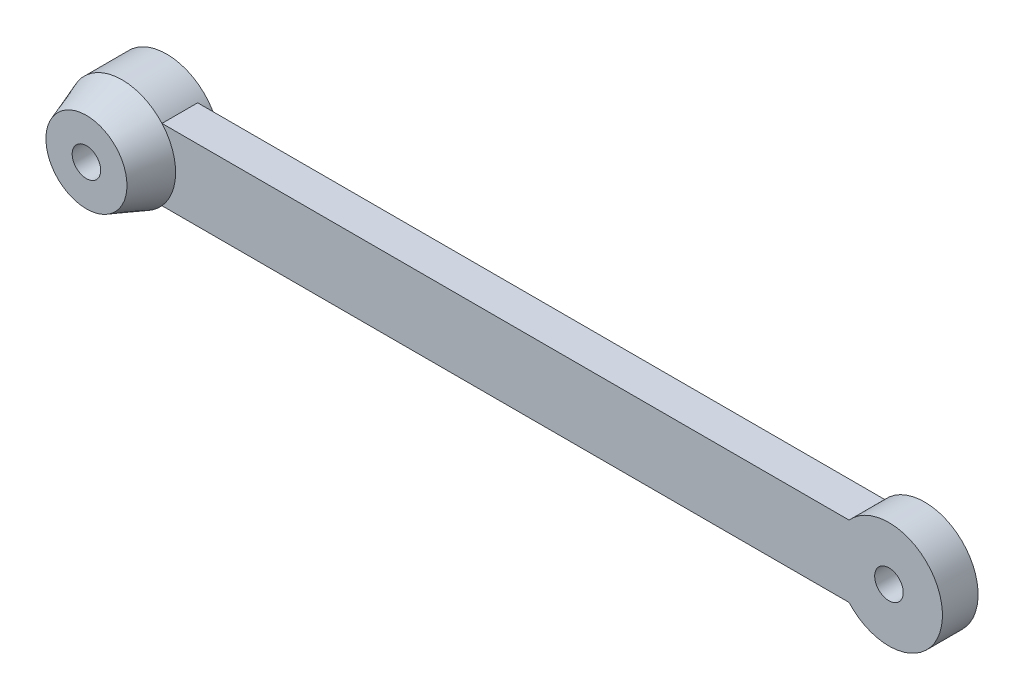
ISO-10303-21;
HEADER;
FILE_DESCRIPTION(('STEP AP214'),'2;1');
FILE_NAME('part.step','',(''),(''),'','','');
FILE_SCHEMA(('AUTOMOTIVE_DESIGN { 1 0 10303 214 1 1 1 1 }'));
ENDSEC;
DATA;
#1=APPLICATION_CONTEXT('core data for automotive mechanical design processes');
#2=APPLICATION_PROTOCOL_DEFINITION('international standard','automotive_design',2000,#1);
#3=PRODUCT_CONTEXT('',#1,'mechanical');
#4=PRODUCT('Part','Part','',(#3));
#5=PRODUCT_RELATED_PRODUCT_CATEGORY('part','',(#4));
#6=PRODUCT_DEFINITION_FORMATION('','',#4);
#7=PRODUCT_DEFINITION_CONTEXT('part definition',#1,'design');
#8=PRODUCT_DEFINITION('design','',#6,#7);
#9=PRODUCT_DEFINITION_SHAPE('','',#8);
#10=(LENGTH_UNIT() NAMED_UNIT(*) SI_UNIT(.MILLI.,.METRE.));
#11=(NAMED_UNIT(*) PLANE_ANGLE_UNIT() SI_UNIT($,.RADIAN.));
#12=(NAMED_UNIT(*) SI_UNIT($,.STERADIAN.) SOLID_ANGLE_UNIT());
#13=UNCERTAINTY_MEASURE_WITH_UNIT(LENGTH_MEASURE(1.E-05),#10,'distance_accuracy_value','');
#14=(GEOMETRIC_REPRESENTATION_CONTEXT(3) GLOBAL_UNCERTAINTY_ASSIGNED_CONTEXT((#13)) GLOBAL_UNIT_ASSIGNED_CONTEXT((#10,
#11,#12)) REPRESENTATION_CONTEXT('',''));
#15=CARTESIAN_POINT('',(0.,0.,0.));
#16=DIRECTION('',(0.,0.,1.));
#17=DIRECTION('',(1.,0.,0.));
#18=AXIS2_PLACEMENT_3D('',#15,#16,#17);
#19=CARTESIAN_POINT('',(38.018924233825,0.,2.25941205093676));
#20=DIRECTION('',(0.,0.,1.));
#21=DIRECTION('',(1.,0.,0.));
#22=AXIS2_PLACEMENT_3D('',#19,#20,#21);
#23=PLANE('',#22);
#24=CARTESIAN_POINT('',(167.018924233825,0.,2.25941205093676));
#25=DIRECTION('',(0.,0.,-1.));
#26=DIRECTION('',(-1.,0.,0.));
#27=AXIS2_PLACEMENT_3D('',#24,#25,#26);
#28=CIRCLE('',#27,2.4);
#29=CARTESIAN_POINT('',(164.618924233825,0.,2.25941205093676));
#30=VERTEX_POINT('',#29);
#31=EDGE_CURVE('E125',#30,#30,#28,.T.);
#32=ORIENTED_EDGE('',*,*,#31,.F.);
#33=EDGE_LOOP('',(#32));
#34=FACE_BOUND('',#33,.T.);
#35=CARTESIAN_POINT('',(38.018924233825,0.,2.25941205093676));
#36=DIRECTION('',(0.,0.,-1.));
#37=DIRECTION('',(-1.,0.,0.));
#38=AXIS2_PLACEMENT_3D('',#35,#36,#37);
#39=CIRCLE('',#38,9.);
#40=CARTESIAN_POINT('',(44.7271281663243,6.,2.25941205093676));
#41=VERTEX_POINT('',#40);
#42=CARTESIAN_POINT('',(44.7271281663243,-6.00000000000003,2.25941205093676));
#43=VERTEX_POINT('',#42);
#44=EDGE_CURVE('E85',#41,#43,#39,.T.);
#45=ORIENTED_EDGE('',*,*,#44,.F.);
#46=DIRECTION('',(1.,0.,0.));
#47=VECTOR('',#46,1.);
#48=CARTESIAN_POINT('',(38.018924233825,6.,2.25941205093676));
#49=LINE('',#48,#47);
#50=CARTESIAN_POINT('',(160.310720301326,6.,2.25941205093676));
#51=VERTEX_POINT('',#50);
#52=EDGE_CURVE('E86',#41,#51,#49,.T.);
#53=ORIENTED_EDGE('',*,*,#52,.T.);
#54=CARTESIAN_POINT('',(167.018924233825,0.,2.25941205093676));
#55=DIRECTION('',(0.,0.,1.));
#56=DIRECTION('',(1.,0.,0.));
#57=AXIS2_PLACEMENT_3D('',#54,#55,#56);
#58=CIRCLE('',#57,9.00000000000001);
#59=CARTESIAN_POINT('',(160.310720301326,-6.,2.25941205093676));
#60=VERTEX_POINT('',#59);
#61=EDGE_CURVE('E47',#60,#51,#58,.T.);
#62=ORIENTED_EDGE('',*,*,#61,.F.);
#63=DIRECTION('',(-1.,0.,0.));
#64=VECTOR('',#63,1.);
#65=CARTESIAN_POINT('',(38.018924233825,-6.00000000000003,2.25941205093676));
#66=LINE('',#65,#64);
#67=EDGE_CURVE('E88',#60,#43,#66,.T.);
#68=ORIENTED_EDGE('',*,*,#67,.T.);
#69=EDGE_LOOP('',(#45,#53,#62,#68));
#70=FACE_BOUND('',#69,.T.);
#71=ADVANCED_FACE('F43',(#34,#70),#23,.F.);
#72=CARTESIAN_POINT('',(167.018924233825,0.,8.25941205093676));
#73=DIRECTION('',(0.,0.,-1.));
#74=DIRECTION('',(-1.,0.,0.));
#75=AXIS2_PLACEMENT_3D('',#72,#73,#74);
#76=CYLINDRICAL_SURFACE('',#75,9.00000000000001);
#77=CARTESIAN_POINT('',(167.018924233825,0.,8.25941205093676));
#78=DIRECTION('',(0.,0.,1.));
#79=DIRECTION('',(1.,0.,0.));
#80=AXIS2_PLACEMENT_3D('',#77,#78,#79);
#81=CIRCLE('',#80,9.00000000000001);
#82=CARTESIAN_POINT('',(160.310720301326,-6.,8.25941205093676));
#83=VERTEX_POINT('',#82);
#84=CARTESIAN_POINT('',(160.310720301326,6.,8.25941205093676));
#85=VERTEX_POINT('',#84);
#86=EDGE_CURVE('E11',#83,#85,#81,.T.);
#87=ORIENTED_EDGE('',*,*,#86,.F.);
#88=DIRECTION('',(0.,0.,-1.));
#89=VECTOR('',#88,1.);
#90=CARTESIAN_POINT('',(160.310720301326,-6.,5.25941205093676));
#91=LINE('',#90,#89);
#92=EDGE_CURVE('E105',#83,#60,#91,.T.);
#93=ORIENTED_EDGE('',*,*,#92,.T.);
#94=ORIENTED_EDGE('',*,*,#61,.T.);
#95=DIRECTION('',(0.,0.,-1.));
#96=VECTOR('',#95,1.);
#97=CARTESIAN_POINT('',(160.310720301326,6.,5.25941205093676));
#98=LINE('',#97,#96);
#99=EDGE_CURVE('E95',#85,#51,#98,.T.);
#100=ORIENTED_EDGE('',*,*,#99,.F.);
#101=EDGE_LOOP('',(#87,#93,#94,#100));
#102=FACE_BOUND('',#101,.T.);
#103=ADVANCED_FACE('F45',(#102),#76,.T.);
#104=CARTESIAN_POINT('',(38.018924233825,0.,8.25941205093676));
#105=DIRECTION('',(0.,0.,-1.));
#106=DIRECTION('',(-1.,0.,0.));
#107=AXIS2_PLACEMENT_3D('',#104,#105,#106);
#108=CYLINDRICAL_SURFACE('',#107,9.);
#109=DIRECTION('',(0.,0.,-1.));
#110=VECTOR('',#109,1.);
#111=CARTESIAN_POINT('',(44.7271281663243,-6.00000000000003,5.25941205093676));
#112=LINE('',#111,#110);
#113=CARTESIAN_POINT('',(44.7271281663243,-6.00000000000003,8.25941205093676));
#114=VERTEX_POINT('',#113);
#115=EDGE_CURVE('E102',#114,#43,#112,.T.);
#116=ORIENTED_EDGE('',*,*,#115,.F.);
#117=CARTESIAN_POINT('',(38.018924233825,0.,8.25941205093676));
#118=DIRECTION('',(0.,0.,1.));
#119=DIRECTION('',(1.,0.,0.));
#120=AXIS2_PLACEMENT_3D('',#117,#118,#119);
#121=CIRCLE('',#120,9.);
#122=CARTESIAN_POINT('',(44.7271281663243,6.,8.25941205093676));
#123=VERTEX_POINT('',#122);
#124=EDGE_CURVE('E96',#123,#114,#121,.T.);
#125=ORIENTED_EDGE('',*,*,#124,.F.);
#126=DIRECTION('',(0.,0.,-1.));
#127=VECTOR('',#126,1.);
#128=CARTESIAN_POINT('',(44.7271281663243,6.,5.25941205093676));
#129=LINE('',#128,#127);
#130=EDGE_CURVE('E58',#123,#41,#129,.T.);
#131=ORIENTED_EDGE('',*,*,#130,.T.);
#132=ORIENTED_EDGE('',*,*,#44,.T.);
#133=EDGE_LOOP('',(#116,#125,#131,#132));
#134=FACE_BOUND('',#133,.T.);
#135=CARTESIAN_POINT('',(38.018924233825,0.,0.759412050936755));
#136=DIRECTION('',(0.,0.,-1.));
#137=DIRECTION('',(-1.,0.,0.));
#138=AXIS2_PLACEMENT_3D('',#135,#136,#137);
#139=CIRCLE('',#138,9.);
#140=CARTESIAN_POINT('',(29.018924233825,0.,0.759412050936755));
#141=VERTEX_POINT('',#140);
#142=EDGE_CURVE('E91',#141,#141,#139,.T.);
#143=ORIENTED_EDGE('',*,*,#142,.F.);
#144=EDGE_LOOP('',(#143));
#145=FACE_BOUND('',#144,.T.);
#146=ADVANCED_FACE('F99',(#134,#145),#108,.T.);
#147=CARTESIAN_POINT('',(38.018924233825,0.,8.25941205093676));
#148=DIRECTION('',(0.,0.,1.));
#149=DIRECTION('',(1.,0.,0.));
#150=AXIS2_PLACEMENT_3D('',#147,#148,#149);
#151=PLANE('',#150);
#152=CARTESIAN_POINT('',(167.018924233825,0.,8.25941205093676));
#153=DIRECTION('',(0.,0.,1.));
#154=DIRECTION('',(1.,0.,0.));
#155=AXIS2_PLACEMENT_3D('',#152,#153,#154);
#156=CIRCLE('',#155,2.4);
#157=CARTESIAN_POINT('',(169.418924233825,0.,8.25941205093676));
#158=VERTEX_POINT('',#157);
#159=EDGE_CURVE('E122',#158,#158,#156,.T.);
#160=ORIENTED_EDGE('',*,*,#159,.F.);
#161=EDGE_LOOP('',(#160));
#162=FACE_BOUND('',#161,.T.);
#163=ORIENTED_EDGE('',*,*,#86,.T.);
#164=DIRECTION('',(-1.,0.,0.));
#165=VECTOR('',#164,1.);
#166=CARTESIAN_POINT('',(38.018924233825,6.,8.25941205093676));
#167=LINE('',#166,#165);
#168=EDGE_CURVE('E117',#85,#123,#167,.T.);
#169=ORIENTED_EDGE('',*,*,#168,.T.);
#170=CARTESIAN_POINT('',(38.018924233825,0.,8.25941205093676));
#171=DIRECTION('',(0.,0.,1.));
#172=DIRECTION('',(1.,0.,0.));
#173=AXIS2_PLACEMENT_3D('',#170,#171,#172);
#174=CIRCLE('',#173,9.);
#175=EDGE_CURVE('E114',#123,#114,#174,.F.);
#176=ORIENTED_EDGE('',*,*,#175,.T.);
#177=DIRECTION('',(1.,0.,0.));
#178=VECTOR('',#177,1.);
#179=CARTESIAN_POINT('',(38.018924233825,-6.00000000000003,8.25941205093676));
#180=LINE('',#179,#178);
#181=EDGE_CURVE('E119',#114,#83,#180,.T.);
#182=ORIENTED_EDGE('',*,*,#181,.T.);
#183=EDGE_LOOP('',(#163,#169,#176,#182));
#184=FACE_BOUND('',#183,.T.);
#185=ADVANCED_FACE('F155',(#162,#184),#151,.T.);
#186=CARTESIAN_POINT('',(38.018924233825,6.,5.25941205093676));
#187=DIRECTION('',(0.,1.,0.));
#188=DIRECTION('',(0.,0.,1.));
#189=AXIS2_PLACEMENT_3D('',#186,#187,#188);
#190=PLANE('',#189);
#191=ORIENTED_EDGE('',*,*,#52,.F.);
#192=ORIENTED_EDGE('',*,*,#130,.F.);
#193=ORIENTED_EDGE('',*,*,#168,.F.);
#194=ORIENTED_EDGE('',*,*,#99,.T.);
#195=EDGE_LOOP('',(#191,#192,#193,#194));
#196=FACE_BOUND('',#195,.T.);
#197=ADVANCED_FACE('F94',(#196),#190,.T.);
#198=CARTESIAN_POINT('',(38.018924233825,-6.00000000000003,5.25941205093676));
#199=DIRECTION('',(0.,-1.,0.));
#200=DIRECTION('',(1.,0.,0.));
#201=AXIS2_PLACEMENT_3D('',#198,#199,#200);
#202=PLANE('',#201);
#203=ORIENTED_EDGE('',*,*,#67,.F.);
#204=ORIENTED_EDGE('',*,*,#92,.F.);
#205=ORIENTED_EDGE('',*,*,#181,.F.);
#206=ORIENTED_EDGE('',*,*,#115,.T.);
#207=EDGE_LOOP('',(#203,#204,#205,#206));
#208=FACE_BOUND('',#207,.T.);
#209=ADVANCED_FACE('F161',(#208),#202,.T.);
#210=CARTESIAN_POINT('',(38.018924233825,0.,8.25941205093676));
#211=DIRECTION('',(0.,0.,-1.));
#212=DIRECTION('',(1.,0.,0.));
#213=AXIS2_PLACEMENT_3D('',#210,#211,#212);
#214=CONICAL_SURFACE('',#213,9.,0.349065850398866);
#215=CARTESIAN_POINT('',(38.018924233825,0.,14.2594120509368));
#216=DIRECTION('',(0.,0.,1.));
#217=DIRECTION('',(1.,0.,0.));
#218=AXIS2_PLACEMENT_3D('',#215,#216,#217);
#219=CIRCLE('',#218,6.81617859440278);
#220=CARTESIAN_POINT('',(44.8351028282277,0.,14.2594120509368));
#221=VERTEX_POINT('',#220);
#222=EDGE_CURVE('E111',#221,#221,#219,.T.);
#223=ORIENTED_EDGE('',*,*,#222,.F.);
#224=EDGE_LOOP('',(#223));
#225=FACE_BOUND('',#224,.T.);
#226=ORIENTED_EDGE('',*,*,#124,.T.);
#227=ORIENTED_EDGE('',*,*,#175,.F.);
#228=EDGE_LOOP('',(#226,#227));
#229=FACE_BOUND('',#228,.T.);
#230=ADVANCED_FACE('F164',(#225,#229),#214,.T.);
#231=CARTESIAN_POINT('',(38.018924233825,0.,14.2594120509368));
#232=DIRECTION('',(0.,0.,1.));
#233=DIRECTION('',(1.,0.,0.));
#234=AXIS2_PLACEMENT_3D('',#231,#232,#233);
#235=PLANE('',#234);
#236=CARTESIAN_POINT('',(38.018924233825,0.,14.2594120509368));
#237=DIRECTION('',(0.,0.,-1.));
#238=DIRECTION('',(-1.,0.,0.));
#239=AXIS2_PLACEMENT_3D('',#236,#237,#238);
#240=CIRCLE('',#239,2.4);
#241=CARTESIAN_POINT('',(35.618924233825,0.,14.2594120509368));
#242=VERTEX_POINT('',#241);
#243=EDGE_CURVE('E128',#242,#242,#240,.T.);
#244=ORIENTED_EDGE('',*,*,#243,.T.);
#245=EDGE_LOOP('',(#244));
#246=FACE_BOUND('',#245,.T.);
#247=ORIENTED_EDGE('',*,*,#222,.T.);
#248=EDGE_LOOP('',(#247));
#249=FACE_BOUND('',#248,.T.);
#250=ADVANCED_FACE('F170',(#246,#249),#235,.T.);
#251=CARTESIAN_POINT('',(167.018924233825,0.,14.2594120509368));
#252=DIRECTION('',(0.,0.,-1.));
#253=DIRECTION('',(-1.,0.,0.));
#254=AXIS2_PLACEMENT_3D('',#251,#252,#253);
#255=CYLINDRICAL_SURFACE('',#254,2.4);
#256=ORIENTED_EDGE('',*,*,#159,.T.);
#257=EDGE_LOOP('',(#256));
#258=FACE_BOUND('',#257,.T.);
#259=ORIENTED_EDGE('',*,*,#31,.T.);
#260=EDGE_LOOP('',(#259));
#261=FACE_BOUND('',#260,.T.);
#262=ADVANCED_FACE('F145',(#258,#261),#255,.F.);
#263=CARTESIAN_POINT('',(38.018924233825,0.,14.2594120509368));
#264=DIRECTION('',(0.,0.,-1.));
#265=DIRECTION('',(-1.,0.,0.));
#266=AXIS2_PLACEMENT_3D('',#263,#264,#265);
#267=CYLINDRICAL_SURFACE('',#266,2.4);
#268=ORIENTED_EDGE('',*,*,#243,.F.);
#269=EDGE_LOOP('',(#268));
#270=FACE_BOUND('',#269,.T.);
#271=CARTESIAN_POINT('',(38.018924233825,0.,0.759412050936755));
#272=DIRECTION('',(0.,0.,-1.));
#273=DIRECTION('',(-1.,0.,0.));
#274=AXIS2_PLACEMENT_3D('',#271,#272,#273);
#275=CIRCLE('',#274,2.4);
#276=CARTESIAN_POINT('',(35.618924233825,0.,0.759412050936755));
#277=VERTEX_POINT('',#276);
#278=EDGE_CURVE('E92',#277,#277,#275,.T.);
#279=ORIENTED_EDGE('',*,*,#278,.T.);
#280=EDGE_LOOP('',(#279));
#281=FACE_BOUND('',#280,.T.);
#282=ADVANCED_FACE('F136',(#270,#281),#267,.F.);
#283=CARTESIAN_POINT('',(38.018924233825,0.,0.759412050936755));
#284=DIRECTION('',(0.,0.,-1.));
#285=DIRECTION('',(-1.,0.,0.));
#286=AXIS2_PLACEMENT_3D('',#283,#284,#285);
#287=PLANE('',#286);
#288=ORIENTED_EDGE('',*,*,#142,.T.);
#289=EDGE_LOOP('',(#288));
#290=FACE_BOUND('',#289,.T.);
#291=ORIENTED_EDGE('',*,*,#278,.F.);
#292=EDGE_LOOP('',(#291));
#293=FACE_BOUND('',#292,.T.);
#294=ADVANCED_FACE('F138',(#290,#293),#287,.T.);
#295=CLOSED_SHELL('',(#71,#103,#146,#185,#197,#209,#230,#250,#262,#282,#294));
#296=MANIFOLD_SOLID_BREP('B2',#295);
#297=ADVANCED_BREP_SHAPE_REPRESENTATION('',(#18,#296),#14);
#298=SHAPE_DEFINITION_REPRESENTATION(#9,#297);
ENDSEC;
END-ISO-10303-21;
